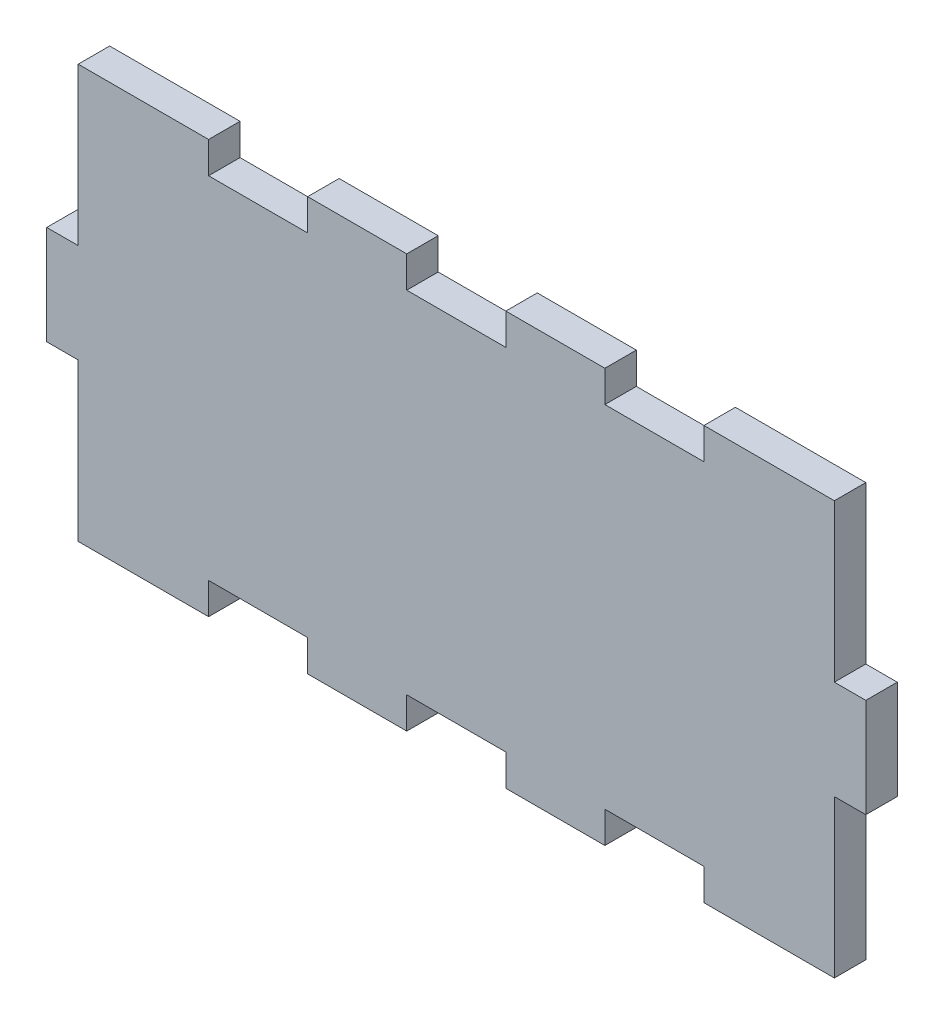
ISO-10303-21;
HEADER;
FILE_DESCRIPTION(('STEP AP214'),'2;1');
FILE_NAME('part.step','',(''),(''),'','','');
FILE_SCHEMA(('AUTOMOTIVE_DESIGN { 1 0 10303 214 1 1 1 1 }'));
ENDSEC;
DATA;
#1=APPLICATION_CONTEXT('core data for automotive mechanical design processes');
#2=APPLICATION_PROTOCOL_DEFINITION('international standard','automotive_design',2000,#1);
#3=PRODUCT_CONTEXT('',#1,'mechanical');
#4=PRODUCT('Part','Part','',(#3));
#5=PRODUCT_RELATED_PRODUCT_CATEGORY('part','',(#4));
#6=PRODUCT_DEFINITION_FORMATION('','',#4);
#7=PRODUCT_DEFINITION_CONTEXT('part definition',#1,'design');
#8=PRODUCT_DEFINITION('design','',#6,#7);
#9=PRODUCT_DEFINITION_SHAPE('','',#8);
#10=(LENGTH_UNIT() NAMED_UNIT(*) SI_UNIT(.MILLI.,.METRE.));
#11=(NAMED_UNIT(*) PLANE_ANGLE_UNIT() SI_UNIT($,.RADIAN.));
#12=(NAMED_UNIT(*) SI_UNIT($,.STERADIAN.) SOLID_ANGLE_UNIT());
#13=UNCERTAINTY_MEASURE_WITH_UNIT(LENGTH_MEASURE(1.E-05),#10,'distance_accuracy_value','');
#14=(GEOMETRIC_REPRESENTATION_CONTEXT(3) GLOBAL_UNCERTAINTY_ASSIGNED_CONTEXT((#13)) GLOBAL_UNIT_ASSIGNED_CONTEXT((#10,
#11,#12)) REPRESENTATION_CONTEXT('',''));
#15=CARTESIAN_POINT('',(0.,0.,0.));
#16=DIRECTION('',(0.,0.,1.));
#17=DIRECTION('',(1.,0.,0.));
#18=AXIS2_PLACEMENT_3D('',#15,#16,#17);
#19=CARTESIAN_POINT('',(-82.675,41.7195,6.35));
#20=DIRECTION('',(0.,-1.,0.));
#21=DIRECTION('',(0.,0.,-1.));
#22=AXIS2_PLACEMENT_3D('',#19,#20,#21);
#23=PLANE('',#22);
#24=DIRECTION('',(0.,0.,1.));
#25=VECTOR('',#24,1.);
#26=CARTESIAN_POINT('',(-30.,41.7195,0.));
#27=LINE('',#26,#25);
#28=CARTESIAN_POINT('',(-30.,41.7195,0.));
#29=VERTEX_POINT('',#28);
#30=CARTESIAN_POINT('',(-30.,41.7195,6.35));
#31=VERTEX_POINT('',#30);
#32=EDGE_CURVE('E333',#29,#31,#27,.T.);
#33=ORIENTED_EDGE('',*,*,#32,.T.);
#34=DIRECTION('',(-1.,0.,0.));
#35=VECTOR('',#34,1.);
#36=CARTESIAN_POINT('',(-82.675,41.7195,6.35));
#37=LINE('',#36,#35);
#38=CARTESIAN_POINT('',(-10.,41.7195,6.35));
#39=VERTEX_POINT('',#38);
#40=EDGE_CURVE('E714',#39,#31,#37,.T.);
#41=ORIENTED_EDGE('',*,*,#40,.F.);
#42=DIRECTION('',(0.,0.,1.));
#43=VECTOR('',#42,1.);
#44=CARTESIAN_POINT('',(-10.,41.7195,0.));
#45=LINE('',#44,#43);
#46=CARTESIAN_POINT('',(-10.,41.7195,0.));
#47=VERTEX_POINT('',#46);
#48=EDGE_CURVE('E378',#47,#39,#45,.T.);
#49=ORIENTED_EDGE('',*,*,#48,.F.);
#50=DIRECTION('',(-1.,0.,0.));
#51=VECTOR('',#50,1.);
#52=CARTESIAN_POINT('',(-82.675,41.7195,0.));
#53=LINE('',#52,#51);
#54=EDGE_CURVE('E730',#47,#29,#53,.T.);
#55=ORIENTED_EDGE('',*,*,#54,.T.);
#56=EDGE_LOOP('',(#33,#41,#49,#55));
#57=FACE_BOUND('',#56,.T.);
#58=ADVANCED_FACE('F39',(#57),#23,.F.);
#59=DIRECTION('',(0.,0.,1.));
#60=VECTOR('',#59,1.);
#61=CARTESIAN_POINT('',(-50.,41.7195,0.));
#62=LINE('',#61,#60);
#63=CARTESIAN_POINT('',(-50.,41.7195,0.));
#64=VERTEX_POINT('',#63);
#65=CARTESIAN_POINT('',(-50.,41.7195,6.35));
#66=VERTEX_POINT('',#65);
#67=EDGE_CURVE('E350',#64,#66,#62,.T.);
#68=ORIENTED_EDGE('',*,*,#67,.F.);
#69=CARTESIAN_POINT('',(-76.325,41.7195,0.));
#70=VERTEX_POINT('',#69);
#71=EDGE_CURVE('E570',#64,#70,#53,.T.);
#72=ORIENTED_EDGE('',*,*,#71,.T.);
#73=DIRECTION('',(0.,0.,1.));
#74=VECTOR('',#73,1.);
#75=CARTESIAN_POINT('',(-76.325,41.7195,0.));
#76=LINE('',#75,#74);
#77=CARTESIAN_POINT('',(-76.325,41.7195,6.35));
#78=VERTEX_POINT('',#77);
#79=EDGE_CURVE('E563',#70,#78,#76,.T.);
#80=ORIENTED_EDGE('',*,*,#79,.T.);
#81=EDGE_CURVE('E606',#66,#78,#37,.T.);
#82=ORIENTED_EDGE('',*,*,#81,.F.);
#83=EDGE_LOOP('',(#68,#72,#80,#82));
#84=FACE_BOUND('',#83,.T.);
#85=ADVANCED_FACE('F685',(#84),#23,.F.);
#86=DIRECTION('',(0.,0.,1.));
#87=VECTOR('',#86,1.);
#88=CARTESIAN_POINT('',(30.,41.7195,0.));
#89=LINE('',#88,#87);
#90=CARTESIAN_POINT('',(30.,41.7195,0.));
#91=VERTEX_POINT('',#90);
#92=CARTESIAN_POINT('',(30.,41.7195,6.35));
#93=VERTEX_POINT('',#92);
#94=EDGE_CURVE('E313',#91,#93,#89,.T.);
#95=ORIENTED_EDGE('',*,*,#94,.F.);
#96=CARTESIAN_POINT('',(10.,41.7195,0.));
#97=VERTEX_POINT('',#96);
#98=EDGE_CURVE('E297',#91,#97,#53,.T.);
#99=ORIENTED_EDGE('',*,*,#98,.T.);
#100=DIRECTION('',(0.,0.,1.));
#101=VECTOR('',#100,1.);
#102=CARTESIAN_POINT('',(10.,41.7195,0.));
#103=LINE('',#102,#101);
#104=CARTESIAN_POINT('',(10.,41.7195,6.35));
#105=VERTEX_POINT('',#104);
#106=EDGE_CURVE('E382',#97,#105,#103,.T.);
#107=ORIENTED_EDGE('',*,*,#106,.T.);
#108=EDGE_CURVE('E605',#93,#105,#37,.T.);
#109=ORIENTED_EDGE('',*,*,#108,.F.);
#110=EDGE_LOOP('',(#95,#99,#107,#109));
#111=FACE_BOUND('',#110,.T.);
#112=ADVANCED_FACE('F691',(#111),#23,.F.);
#113=DIRECTION('',(0.,0.,1.));
#114=VECTOR('',#113,1.);
#115=CARTESIAN_POINT('',(50.,41.7195,0.));
#116=LINE('',#115,#114);
#117=CARTESIAN_POINT('',(50.,41.7195,0.));
#118=VERTEX_POINT('',#117);
#119=CARTESIAN_POINT('',(50.,41.7195,6.35));
#120=VERTEX_POINT('',#119);
#121=EDGE_CURVE('E317',#118,#120,#116,.T.);
#122=ORIENTED_EDGE('',*,*,#121,.T.);
#123=CARTESIAN_POINT('',(76.325,41.7195,6.35));
#124=VERTEX_POINT('',#123);
#125=EDGE_CURVE('E600',#124,#120,#37,.T.);
#126=ORIENTED_EDGE('',*,*,#125,.F.);
#127=DIRECTION('',(0.,0.,1.));
#128=VECTOR('',#127,1.);
#129=CARTESIAN_POINT('',(76.325,41.7195,0.));
#130=LINE('',#129,#128);
#131=CARTESIAN_POINT('',(76.325,41.7195,0.));
#132=VERTEX_POINT('',#131);
#133=EDGE_CURVE('E534',#132,#124,#130,.T.);
#134=ORIENTED_EDGE('',*,*,#133,.F.);
#135=EDGE_CURVE('E615',#132,#118,#53,.T.);
#136=ORIENTED_EDGE('',*,*,#135,.T.);
#137=EDGE_LOOP('',(#122,#126,#134,#136));
#138=FACE_BOUND('',#137,.T.);
#139=ADVANCED_FACE('F687',(#138),#23,.F.);
#140=CARTESIAN_POINT('',(0.,0.,6.35));
#141=DIRECTION('',(0.,0.,-1.));
#142=DIRECTION('',(-1.,0.,0.));
#143=AXIS2_PLACEMENT_3D('',#140,#141,#142);
#144=PLANE('',#143);
#145=DIRECTION('',(0.,-1.,0.));
#146=VECTOR('',#145,1.);
#147=CARTESIAN_POINT('',(-30.,41.7195,6.35));
#148=LINE('',#147,#146);
#149=CARTESIAN_POINT('',(-30.,35.3695,6.35));
#150=VERTEX_POINT('',#149);
#151=EDGE_CURVE('E334',#31,#150,#148,.T.);
#152=ORIENTED_EDGE('',*,*,#151,.T.);
#153=DIRECTION('',(-1.,0.,0.));
#154=VECTOR('',#153,1.);
#155=CARTESIAN_POINT('',(-30.,35.3695,6.35));
#156=LINE('',#155,#154);
#157=CARTESIAN_POINT('',(-50.,35.3695,6.35));
#158=VERTEX_POINT('',#157);
#159=EDGE_CURVE('E327',#150,#158,#156,.T.);
#160=ORIENTED_EDGE('',*,*,#159,.T.);
#161=DIRECTION('',(0.,1.,0.));
#162=VECTOR('',#161,1.);
#163=CARTESIAN_POINT('',(-50.,41.7195,6.35));
#164=LINE('',#163,#162);
#165=EDGE_CURVE('E338',#158,#66,#164,.T.);
#166=ORIENTED_EDGE('',*,*,#165,.T.);
#167=ORIENTED_EDGE('',*,*,#81,.T.);
#168=DIRECTION('',(0.,1.,0.));
#169=VECTOR('',#168,1.);
#170=CARTESIAN_POINT('',(-76.325,10.,6.35));
#171=LINE('',#170,#169);
#172=CARTESIAN_POINT('',(-76.325,10.,6.35));
#173=VERTEX_POINT('',#172);
#174=EDGE_CURVE('E581',#173,#78,#171,.T.);
#175=ORIENTED_EDGE('',*,*,#174,.F.);
#176=DIRECTION('',(1.,0.,0.));
#177=VECTOR('',#176,1.);
#178=CARTESIAN_POINT('',(-82.675,10.,6.35));
#179=LINE('',#178,#177);
#180=CARTESIAN_POINT('',(-82.675,10.,6.35));
#181=VERTEX_POINT('',#180);
#182=EDGE_CURVE('E520',#181,#173,#179,.T.);
#183=ORIENTED_EDGE('',*,*,#182,.F.);
#184=DIRECTION('',(0.,-1.,0.));
#185=VECTOR('',#184,1.);
#186=CARTESIAN_POINT('',(-82.675,41.7195,6.35));
#187=LINE('',#186,#185);
#188=CARTESIAN_POINT('',(-82.675,-10.,6.35));
#189=VERTEX_POINT('',#188);
#190=EDGE_CURVE('E604',#181,#189,#187,.T.);
#191=ORIENTED_EDGE('',*,*,#190,.T.);
#192=DIRECTION('',(-1.,0.,0.));
#193=VECTOR('',#192,1.);
#194=CARTESIAN_POINT('',(-82.675,-10.,6.35));
#195=LINE('',#194,#193);
#196=CARTESIAN_POINT('',(-76.325,-10.,6.35));
#197=VERTEX_POINT('',#196);
#198=EDGE_CURVE('E554',#197,#189,#195,.T.);
#199=ORIENTED_EDGE('',*,*,#198,.F.);
#200=DIRECTION('',(0.,1.,0.));
#201=VECTOR('',#200,1.);
#202=CARTESIAN_POINT('',(-76.325,-41.7195,6.35));
#203=LINE('',#202,#201);
#204=CARTESIAN_POINT('',(-76.325,-41.7195,6.35));
#205=VERTEX_POINT('',#204);
#206=EDGE_CURVE('E559',#205,#197,#203,.T.);
#207=ORIENTED_EDGE('',*,*,#206,.F.);
#208=DIRECTION('',(1.,0.,0.));
#209=VECTOR('',#208,1.);
#210=CARTESIAN_POINT('',(-82.675,-41.7195,6.35));
#211=LINE('',#210,#209);
#212=CARTESIAN_POINT('',(-50.,-41.7195,6.35));
#213=VERTEX_POINT('',#212);
#214=EDGE_CURVE('E48',#205,#213,#211,.T.);
#215=ORIENTED_EDGE('',*,*,#214,.T.);
#216=DIRECTION('',(0.,-1.,0.));
#217=VECTOR('',#216,1.);
#218=CARTESIAN_POINT('',(-50.,-41.7195,6.35));
#219=LINE('',#218,#217);
#220=CARTESIAN_POINT('',(-50.,-35.3695,6.35));
#221=VERTEX_POINT('',#220);
#222=EDGE_CURVE('E434',#221,#213,#219,.T.);
#223=ORIENTED_EDGE('',*,*,#222,.F.);
#224=DIRECTION('',(-1.,0.,0.));
#225=VECTOR('',#224,1.);
#226=CARTESIAN_POINT('',(-30.,-35.3695,6.35));
#227=LINE('',#226,#225);
#228=CARTESIAN_POINT('',(-30.,-35.3695,6.35));
#229=VERTEX_POINT('',#228);
#230=EDGE_CURVE('E446',#229,#221,#227,.T.);
#231=ORIENTED_EDGE('',*,*,#230,.F.);
#232=DIRECTION('',(0.,1.,0.));
#233=VECTOR('',#232,1.);
#234=CARTESIAN_POINT('',(-30.,-41.7195,6.35));
#235=LINE('',#234,#233);
#236=CARTESIAN_POINT('',(-30.,-41.7195,6.35));
#237=VERTEX_POINT('',#236);
#238=EDGE_CURVE('E381',#237,#229,#235,.T.);
#239=ORIENTED_EDGE('',*,*,#238,.F.);
#240=CARTESIAN_POINT('',(-10.,-41.7195,6.35));
#241=VERTEX_POINT('',#240);
#242=EDGE_CURVE('E613',#237,#241,#211,.T.);
#243=ORIENTED_EDGE('',*,*,#242,.T.);
#244=DIRECTION('',(0.,-1.,0.));
#245=VECTOR('',#244,1.);
#246=CARTESIAN_POINT('',(-10.,-41.7195,6.35));
#247=LINE('',#246,#245);
#248=CARTESIAN_POINT('',(-10.,-35.3695,6.35));
#249=VERTEX_POINT('',#248);
#250=EDGE_CURVE('E419',#249,#241,#247,.T.);
#251=ORIENTED_EDGE('',*,*,#250,.F.);
#252=DIRECTION('',(-1.,0.,0.));
#253=VECTOR('',#252,1.);
#254=CARTESIAN_POINT('',(-10.,-35.3695,6.35));
#255=LINE('',#254,#253);
#256=CARTESIAN_POINT('',(10.,-35.3695,6.35));
#257=VERTEX_POINT('',#256);
#258=EDGE_CURVE('E468',#257,#249,#255,.T.);
#259=ORIENTED_EDGE('',*,*,#258,.F.);
#260=DIRECTION('',(0.,1.,0.));
#261=VECTOR('',#260,1.);
#262=CARTESIAN_POINT('',(10.,-41.7195,6.35));
#263=LINE('',#262,#261);
#264=CARTESIAN_POINT('',(10.,-41.7195,6.35));
#265=VERTEX_POINT('',#264);
#266=EDGE_CURVE('E479',#265,#257,#263,.T.);
#267=ORIENTED_EDGE('',*,*,#266,.F.);
#268=CARTESIAN_POINT('',(30.,-41.7195,6.35));
#269=VERTEX_POINT('',#268);
#270=EDGE_CURVE('E657',#265,#269,#211,.T.);
#271=ORIENTED_EDGE('',*,*,#270,.T.);
#272=DIRECTION('',(0.,-1.,0.));
#273=VECTOR('',#272,1.);
#274=CARTESIAN_POINT('',(30.,-41.7195,6.35));
#275=LINE('',#274,#273);
#276=CARTESIAN_POINT('',(30.,-35.3695,6.35));
#277=VERTEX_POINT('',#276);
#278=EDGE_CURVE('E405',#277,#269,#275,.T.);
#279=ORIENTED_EDGE('',*,*,#278,.F.);
#280=DIRECTION('',(-1.,0.,0.));
#281=VECTOR('',#280,1.);
#282=CARTESIAN_POINT('',(30.,-35.3695,6.35));
#283=LINE('',#282,#281);
#284=CARTESIAN_POINT('',(50.,-35.3695,6.35));
#285=VERTEX_POINT('',#284);
#286=EDGE_CURVE('E396',#285,#277,#283,.T.);
#287=ORIENTED_EDGE('',*,*,#286,.F.);
#288=DIRECTION('',(0.,1.,0.));
#289=VECTOR('',#288,1.);
#290=CARTESIAN_POINT('',(50.,-41.7195,6.35));
#291=LINE('',#290,#289);
#292=CARTESIAN_POINT('',(50.,-41.7195,6.35));
#293=VERTEX_POINT('',#292);
#294=EDGE_CURVE('E408',#293,#285,#291,.T.);
#295=ORIENTED_EDGE('',*,*,#294,.F.);
#296=CARTESIAN_POINT('',(76.325,-41.7195,6.35));
#297=VERTEX_POINT('',#296);
#298=EDGE_CURVE('E610',#293,#297,#211,.T.);
#299=ORIENTED_EDGE('',*,*,#298,.T.);
#300=DIRECTION('',(0.,1.,0.));
#301=VECTOR('',#300,1.);
#302=CARTESIAN_POINT('',(76.325,-41.7195,6.35));
#303=LINE('',#302,#301);
#304=CARTESIAN_POINT('',(76.325,-10.,6.35));
#305=VERTEX_POINT('',#304);
#306=EDGE_CURVE('E503',#297,#305,#303,.T.);
#307=ORIENTED_EDGE('',*,*,#306,.T.);
#308=DIRECTION('',(1.,0.,0.));
#309=VECTOR('',#308,1.);
#310=CARTESIAN_POINT('',(82.675,-10.,6.35));
#311=LINE('',#310,#309);
#312=CARTESIAN_POINT('',(82.675,-10.,6.35));
#313=VERTEX_POINT('',#312);
#314=EDGE_CURVE('E508',#305,#313,#311,.T.);
#315=ORIENTED_EDGE('',*,*,#314,.T.);
#316=DIRECTION('',(0.,1.,0.));
#317=VECTOR('',#316,1.);
#318=CARTESIAN_POINT('',(82.675,41.7195,6.35));
#319=LINE('',#318,#317);
#320=CARTESIAN_POINT('',(82.675,10.,6.35));
#321=VERTEX_POINT('',#320);
#322=EDGE_CURVE('E11',#313,#321,#319,.T.);
#323=ORIENTED_EDGE('',*,*,#322,.T.);
#324=DIRECTION('',(-1.,0.,0.));
#325=VECTOR('',#324,1.);
#326=CARTESIAN_POINT('',(82.675,10.,6.35));
#327=LINE('',#326,#325);
#328=CARTESIAN_POINT('',(76.325,10.,6.35));
#329=VERTEX_POINT('',#328);
#330=EDGE_CURVE('E530',#321,#329,#327,.T.);
#331=ORIENTED_EDGE('',*,*,#330,.T.);
#332=DIRECTION('',(0.,1.,0.));
#333=VECTOR('',#332,1.);
#334=CARTESIAN_POINT('',(76.325,10.,6.35));
#335=LINE('',#334,#333);
#336=EDGE_CURVE('E489',#329,#124,#335,.T.);
#337=ORIENTED_EDGE('',*,*,#336,.T.);
#338=ORIENTED_EDGE('',*,*,#125,.T.);
#339=DIRECTION('',(0.,-1.,0.));
#340=VECTOR('',#339,1.);
#341=CARTESIAN_POINT('',(50.,41.7195,6.35));
#342=LINE('',#341,#340);
#343=CARTESIAN_POINT('',(50.,35.3695,6.35));
#344=VERTEX_POINT('',#343);
#345=EDGE_CURVE('E299',#120,#344,#342,.T.);
#346=ORIENTED_EDGE('',*,*,#345,.T.);
#347=DIRECTION('',(-1.,0.,0.));
#348=VECTOR('',#347,1.);
#349=CARTESIAN_POINT('',(30.,35.3695,6.35));
#350=LINE('',#349,#348);
#351=CARTESIAN_POINT('',(30.,35.3695,6.35));
#352=VERTEX_POINT('',#351);
#353=EDGE_CURVE('E303',#344,#352,#350,.T.);
#354=ORIENTED_EDGE('',*,*,#353,.T.);
#355=DIRECTION('',(0.,1.,0.));
#356=VECTOR('',#355,1.);
#357=CARTESIAN_POINT('',(30.,41.7195,6.35));
#358=LINE('',#357,#356);
#359=EDGE_CURVE('E288',#352,#93,#358,.T.);
#360=ORIENTED_EDGE('',*,*,#359,.T.);
#361=ORIENTED_EDGE('',*,*,#108,.T.);
#362=DIRECTION('',(0.,-1.,0.));
#363=VECTOR('',#362,1.);
#364=CARTESIAN_POINT('',(10.,41.7195,6.35));
#365=LINE('',#364,#363);
#366=CARTESIAN_POINT('',(10.,35.3695,6.35));
#367=VERTEX_POINT('',#366);
#368=EDGE_CURVE('E360',#105,#367,#365,.T.);
#369=ORIENTED_EDGE('',*,*,#368,.T.);
#370=DIRECTION('',(-1.,0.,0.));
#371=VECTOR('',#370,1.);
#372=CARTESIAN_POINT('',(-10.,35.3695,6.35));
#373=LINE('',#372,#371);
#374=CARTESIAN_POINT('',(-10.,35.3695,6.35));
#375=VERTEX_POINT('',#374);
#376=EDGE_CURVE('E371',#367,#375,#373,.T.);
#377=ORIENTED_EDGE('',*,*,#376,.T.);
#378=DIRECTION('',(0.,1.,0.));
#379=VECTOR('',#378,1.);
#380=CARTESIAN_POINT('',(-10.,41.7195,6.35));
#381=LINE('',#380,#379);
#382=EDGE_CURVE('E316',#375,#39,#381,.T.);
#383=ORIENTED_EDGE('',*,*,#382,.T.);
#384=ORIENTED_EDGE('',*,*,#40,.T.);
#385=EDGE_LOOP('',(#152,#160,#166,#167,#175,#183,#191,#199,#207,#215,#223,#231,#239,#243,#251,
#259,#267,#271,#279,#287,#295,#299,#307,#315,#323,#331,#337,#338,#346,#354,#360,#361,#369,#377,
#383,#384));
#386=FACE_BOUND('',#385,.T.);
#387=ADVANCED_FACE('F654',(#386),#144,.F.);
#388=CARTESIAN_POINT('',(0.,0.,0.));
#389=DIRECTION('',(0.,0.,-1.));
#390=DIRECTION('',(-1.,0.,0.));
#391=AXIS2_PLACEMENT_3D('',#388,#389,#390);
#392=PLANE('',#391);
#393=DIRECTION('',(-1.,0.,0.));
#394=VECTOR('',#393,1.);
#395=CARTESIAN_POINT('',(-30.,35.3695,0.));
#396=LINE('',#395,#394);
#397=CARTESIAN_POINT('',(-30.,35.3695,0.));
#398=VERTEX_POINT('',#397);
#399=CARTESIAN_POINT('',(-50.,35.3695,0.));
#400=VERTEX_POINT('',#399);
#401=EDGE_CURVE('E330',#398,#400,#396,.T.);
#402=ORIENTED_EDGE('',*,*,#401,.F.);
#403=DIRECTION('',(0.,-1.,0.));
#404=VECTOR('',#403,1.);
#405=CARTESIAN_POINT('',(-30.,41.7195,0.));
#406=LINE('',#405,#404);
#407=EDGE_CURVE('E323',#29,#398,#406,.T.);
#408=ORIENTED_EDGE('',*,*,#407,.F.);
#409=ORIENTED_EDGE('',*,*,#54,.F.);
#410=DIRECTION('',(0.,1.,0.));
#411=VECTOR('',#410,1.);
#412=CARTESIAN_POINT('',(-10.,41.7195,0.));
#413=LINE('',#412,#411);
#414=CARTESIAN_POINT('',(-10.,35.3695,0.));
#415=VERTEX_POINT('',#414);
#416=EDGE_CURVE('E356',#415,#47,#413,.T.);
#417=ORIENTED_EDGE('',*,*,#416,.F.);
#418=DIRECTION('',(-1.,0.,0.));
#419=VECTOR('',#418,1.);
#420=CARTESIAN_POINT('',(-10.,35.3695,0.));
#421=LINE('',#420,#419);
#422=CARTESIAN_POINT('',(10.,35.3695,0.));
#423=VERTEX_POINT('',#422);
#424=EDGE_CURVE('E359',#423,#415,#421,.T.);
#425=ORIENTED_EDGE('',*,*,#424,.F.);
#426=DIRECTION('',(0.,-1.,0.));
#427=VECTOR('',#426,1.);
#428=CARTESIAN_POINT('',(10.,41.7195,0.));
#429=LINE('',#428,#427);
#430=EDGE_CURVE('E363',#97,#423,#429,.T.);
#431=ORIENTED_EDGE('',*,*,#430,.F.);
#432=ORIENTED_EDGE('',*,*,#98,.F.);
#433=DIRECTION('',(0.,1.,0.));
#434=VECTOR('',#433,1.);
#435=CARTESIAN_POINT('',(30.,41.7195,0.));
#436=LINE('',#435,#434);
#437=CARTESIAN_POINT('',(30.,35.3695,0.));
#438=VERTEX_POINT('',#437);
#439=EDGE_CURVE('E282',#438,#91,#436,.T.);
#440=ORIENTED_EDGE('',*,*,#439,.F.);
#441=DIRECTION('',(-1.,0.,0.));
#442=VECTOR('',#441,1.);
#443=CARTESIAN_POINT('',(30.,35.3695,0.));
#444=LINE('',#443,#442);
#445=CARTESIAN_POINT('',(50.,35.3695,0.));
#446=VERTEX_POINT('',#445);
#447=EDGE_CURVE('E272',#446,#438,#444,.T.);
#448=ORIENTED_EDGE('',*,*,#447,.F.);
#449=DIRECTION('',(0.,-1.,0.));
#450=VECTOR('',#449,1.);
#451=CARTESIAN_POINT('',(50.,41.7195,0.));
#452=LINE('',#451,#450);
#453=EDGE_CURVE('E281',#118,#446,#452,.T.);
#454=ORIENTED_EDGE('',*,*,#453,.F.);
#455=ORIENTED_EDGE('',*,*,#135,.F.);
#456=DIRECTION('',(0.,1.,0.));
#457=VECTOR('',#456,1.);
#458=CARTESIAN_POINT('',(76.325,10.,0.));
#459=LINE('',#458,#457);
#460=CARTESIAN_POINT('',(76.325,10.,0.));
#461=VERTEX_POINT('',#460);
#462=EDGE_CURVE('E526',#461,#132,#459,.T.);
#463=ORIENTED_EDGE('',*,*,#462,.F.);
#464=DIRECTION('',(-1.,0.,0.));
#465=VECTOR('',#464,1.);
#466=CARTESIAN_POINT('',(82.675,10.,0.));
#467=LINE('',#466,#465);
#468=CARTESIAN_POINT('',(82.675,10.,0.));
#469=VERTEX_POINT('',#468);
#470=EDGE_CURVE('E529',#469,#461,#467,.T.);
#471=ORIENTED_EDGE('',*,*,#470,.F.);
#472=DIRECTION('',(0.,1.,0.));
#473=VECTOR('',#472,1.);
#474=CARTESIAN_POINT('',(82.675,41.7195,0.));
#475=LINE('',#474,#473);
#476=CARTESIAN_POINT('',(82.675,-10.,0.));
#477=VERTEX_POINT('',#476);
#478=EDGE_CURVE('E42',#477,#469,#475,.T.);
#479=ORIENTED_EDGE('',*,*,#478,.F.);
#480=DIRECTION('',(1.,0.,0.));
#481=VECTOR('',#480,1.);
#482=CARTESIAN_POINT('',(82.675,-10.,0.));
#483=LINE('',#482,#481);
#484=CARTESIAN_POINT('',(76.325,-10.,0.));
#485=VERTEX_POINT('',#484);
#486=EDGE_CURVE('E499',#485,#477,#483,.T.);
#487=ORIENTED_EDGE('',*,*,#486,.F.);
#488=DIRECTION('',(0.,1.,0.));
#489=VECTOR('',#488,1.);
#490=CARTESIAN_POINT('',(76.325,-41.7195,0.));
#491=LINE('',#490,#489);
#492=CARTESIAN_POINT('',(76.325,-41.7195,0.));
#493=VERTEX_POINT('',#492);
#494=EDGE_CURVE('E502',#493,#485,#491,.T.);
#495=ORIENTED_EDGE('',*,*,#494,.F.);
#496=DIRECTION('',(1.,0.,0.));
#497=VECTOR('',#496,1.);
#498=CARTESIAN_POINT('',(-82.675,-41.7195,0.));
#499=LINE('',#498,#497);
#500=CARTESIAN_POINT('',(50.,-41.7195,0.));
#501=VERTEX_POINT('',#500);
#502=EDGE_CURVE('E622',#501,#493,#499,.T.);
#503=ORIENTED_EDGE('',*,*,#502,.F.);
#504=DIRECTION('',(0.,1.,0.));
#505=VECTOR('',#504,1.);
#506=CARTESIAN_POINT('',(50.,-41.7195,0.));
#507=LINE('',#506,#505);
#508=CARTESIAN_POINT('',(50.,-35.3695,0.));
#509=VERTEX_POINT('',#508);
#510=EDGE_CURVE('E395',#501,#509,#507,.T.);
#511=ORIENTED_EDGE('',*,*,#510,.T.);
#512=DIRECTION('',(-1.,0.,0.));
#513=VECTOR('',#512,1.);
#514=CARTESIAN_POINT('',(30.,-35.3695,0.));
#515=LINE('',#514,#513);
#516=CARTESIAN_POINT('',(30.,-35.3695,0.));
#517=VERTEX_POINT('',#516);
#518=EDGE_CURVE('E400',#509,#517,#515,.T.);
#519=ORIENTED_EDGE('',*,*,#518,.T.);
#520=DIRECTION('',(0.,-1.,0.));
#521=VECTOR('',#520,1.);
#522=CARTESIAN_POINT('',(30.,-41.7195,0.));
#523=LINE('',#522,#521);
#524=CARTESIAN_POINT('',(30.,-41.7195,0.));
#525=VERTEX_POINT('',#524);
#526=EDGE_CURVE('E391',#517,#525,#523,.T.);
#527=ORIENTED_EDGE('',*,*,#526,.T.);
#528=CARTESIAN_POINT('',(10.,-41.7195,0.));
#529=VERTEX_POINT('',#528);
#530=EDGE_CURVE('E634',#529,#525,#499,.T.);
#531=ORIENTED_EDGE('',*,*,#530,.F.);
#532=DIRECTION('',(0.,1.,0.));
#533=VECTOR('',#532,1.);
#534=CARTESIAN_POINT('',(10.,-41.7195,0.));
#535=LINE('',#534,#533);
#536=CARTESIAN_POINT('',(10.,-35.3695,0.));
#537=VERTEX_POINT('',#536);
#538=EDGE_CURVE('E467',#529,#537,#535,.T.);
#539=ORIENTED_EDGE('',*,*,#538,.T.);
#540=DIRECTION('',(-1.,0.,0.));
#541=VECTOR('',#540,1.);
#542=CARTESIAN_POINT('',(-10.,-35.3695,0.));
#543=LINE('',#542,#541);
#544=CARTESIAN_POINT('',(-10.,-35.3695,0.));
#545=VERTEX_POINT('',#544);
#546=EDGE_CURVE('E472',#537,#545,#543,.T.);
#547=ORIENTED_EDGE('',*,*,#546,.T.);
#548=DIRECTION('',(0.,-1.,0.));
#549=VECTOR('',#548,1.);
#550=CARTESIAN_POINT('',(-10.,-41.7195,0.));
#551=LINE('',#550,#549);
#552=CARTESIAN_POINT('',(-10.,-41.7195,0.));
#553=VERTEX_POINT('',#552);
#554=EDGE_CURVE('E463',#545,#553,#551,.T.);
#555=ORIENTED_EDGE('',*,*,#554,.T.);
#556=CARTESIAN_POINT('',(-30.,-41.7195,0.));
#557=VERTEX_POINT('',#556);
#558=EDGE_CURVE('E626',#557,#553,#499,.T.);
#559=ORIENTED_EDGE('',*,*,#558,.F.);
#560=DIRECTION('',(0.,1.,0.));
#561=VECTOR('',#560,1.);
#562=CARTESIAN_POINT('',(-30.,-41.7195,0.));
#563=LINE('',#562,#561);
#564=CARTESIAN_POINT('',(-30.,-35.3695,0.));
#565=VERTEX_POINT('',#564);
#566=EDGE_CURVE('E429',#557,#565,#563,.T.);
#567=ORIENTED_EDGE('',*,*,#566,.T.);
#568=DIRECTION('',(-1.,0.,0.));
#569=VECTOR('',#568,1.);
#570=CARTESIAN_POINT('',(-30.,-35.3695,0.));
#571=LINE('',#570,#569);
#572=CARTESIAN_POINT('',(-50.,-35.3695,0.));
#573=VERTEX_POINT('',#572);
#574=EDGE_CURVE('E433',#565,#573,#571,.T.);
#575=ORIENTED_EDGE('',*,*,#574,.T.);
#576=DIRECTION('',(0.,-1.,0.));
#577=VECTOR('',#576,1.);
#578=CARTESIAN_POINT('',(-50.,-41.7195,0.));
#579=LINE('',#578,#577);
#580=CARTESIAN_POINT('',(-50.,-41.7195,0.));
#581=VERTEX_POINT('',#580);
#582=EDGE_CURVE('E438',#573,#581,#579,.T.);
#583=ORIENTED_EDGE('',*,*,#582,.T.);
#584=CARTESIAN_POINT('',(-76.325,-41.7195,0.));
#585=VERTEX_POINT('',#584);
#586=EDGE_CURVE('E623',#585,#581,#499,.T.);
#587=ORIENTED_EDGE('',*,*,#586,.F.);
#588=DIRECTION('',(0.,1.,0.));
#589=VECTOR('',#588,1.);
#590=CARTESIAN_POINT('',(-76.325,-41.7195,0.));
#591=LINE('',#590,#589);
#592=CARTESIAN_POINT('',(-76.325,-10.,0.));
#593=VERTEX_POINT('',#592);
#594=EDGE_CURVE('E549',#585,#593,#591,.T.);
#595=ORIENTED_EDGE('',*,*,#594,.T.);
#596=DIRECTION('',(-1.,0.,0.));
#597=VECTOR('',#596,1.);
#598=CARTESIAN_POINT('',(-82.675,-10.,0.));
#599=LINE('',#598,#597);
#600=CARTESIAN_POINT('',(-82.675,-10.,0.));
#601=VERTEX_POINT('',#600);
#602=EDGE_CURVE('E553',#593,#601,#599,.T.);
#603=ORIENTED_EDGE('',*,*,#602,.T.);
#604=DIRECTION('',(0.,-1.,0.));
#605=VECTOR('',#604,1.);
#606=CARTESIAN_POINT('',(-82.675,41.7195,0.));
#607=LINE('',#606,#605);
#608=CARTESIAN_POINT('',(-82.675,10.,0.));
#609=VERTEX_POINT('',#608);
#610=EDGE_CURVE('E619',#609,#601,#607,.T.);
#611=ORIENTED_EDGE('',*,*,#610,.F.);
#612=DIRECTION('',(1.,0.,0.));
#613=VECTOR('',#612,1.);
#614=CARTESIAN_POINT('',(-82.675,10.,0.));
#615=LINE('',#614,#613);
#616=CARTESIAN_POINT('',(-76.325,10.,0.));
#617=VERTEX_POINT('',#616);
#618=EDGE_CURVE('E576',#609,#617,#615,.T.);
#619=ORIENTED_EDGE('',*,*,#618,.T.);
#620=DIRECTION('',(0.,1.,0.));
#621=VECTOR('',#620,1.);
#622=CARTESIAN_POINT('',(-76.325,10.,0.));
#623=LINE('',#622,#621);
#624=EDGE_CURVE('E580',#617,#70,#623,.T.);
#625=ORIENTED_EDGE('',*,*,#624,.T.);
#626=ORIENTED_EDGE('',*,*,#71,.F.);
#627=DIRECTION('',(0.,1.,0.));
#628=VECTOR('',#627,1.);
#629=CARTESIAN_POINT('',(-50.,41.7195,0.));
#630=LINE('',#629,#628);
#631=EDGE_CURVE('E326',#400,#64,#630,.T.);
#632=ORIENTED_EDGE('',*,*,#631,.F.);
#633=EDGE_LOOP('',(#402,#408,#409,#417,#425,#431,#432,#440,#448,#454,#455,#463,#471,#479,#487,
#495,#503,#511,#519,#527,#531,#539,#547,#555,#559,#567,#575,#583,#587,#595,#603,#611,#619,#625,
#626,#632));
#634=FACE_BOUND('',#633,.T.);
#635=ADVANCED_FACE('F294',(#634),#392,.T.);
#636=CARTESIAN_POINT('',(-82.675,-41.7195,6.35));
#637=DIRECTION('',(0.,1.,0.));
#638=DIRECTION('',(0.,0.,1.));
#639=AXIS2_PLACEMENT_3D('',#636,#637,#638);
#640=PLANE('',#639);
#641=ORIENTED_EDGE('',*,*,#242,.F.);
#642=DIRECTION('',(0.,0.,1.));
#643=VECTOR('',#642,1.);
#644=CARTESIAN_POINT('',(-30.,-41.7195,0.));
#645=LINE('',#644,#643);
#646=EDGE_CURVE('E409',#557,#237,#645,.T.);
#647=ORIENTED_EDGE('',*,*,#646,.F.);
#648=ORIENTED_EDGE('',*,*,#558,.T.);
#649=DIRECTION('',(0.,0.,1.));
#650=VECTOR('',#649,1.);
#651=CARTESIAN_POINT('',(-10.,-41.7195,0.));
#652=LINE('',#651,#650);
#653=EDGE_CURVE('E476',#553,#241,#652,.T.);
#654=ORIENTED_EDGE('',*,*,#653,.T.);
#655=EDGE_LOOP('',(#641,#647,#648,#654));
#656=FACE_BOUND('',#655,.T.);
#657=ADVANCED_FACE('F674',(#656),#640,.F.);
#658=ORIENTED_EDGE('',*,*,#530,.T.);
#659=DIRECTION('',(0.,0.,1.));
#660=VECTOR('',#659,1.);
#661=CARTESIAN_POINT('',(30.,-41.7195,0.));
#662=LINE('',#661,#660);
#663=EDGE_CURVE('E404',#525,#269,#662,.T.);
#664=ORIENTED_EDGE('',*,*,#663,.T.);
#665=ORIENTED_EDGE('',*,*,#270,.F.);
#666=DIRECTION('',(0.,0.,1.));
#667=VECTOR('',#666,1.);
#668=CARTESIAN_POINT('',(10.,-41.7195,0.));
#669=LINE('',#668,#667);
#670=EDGE_CURVE('E493',#529,#265,#669,.T.);
#671=ORIENTED_EDGE('',*,*,#670,.F.);
#672=EDGE_LOOP('',(#658,#664,#665,#671));
#673=FACE_BOUND('',#672,.T.);
#674=ADVANCED_FACE('F645',(#673),#640,.F.);
#675=ORIENTED_EDGE('',*,*,#586,.T.);
#676=DIRECTION('',(0.,0.,1.));
#677=VECTOR('',#676,1.);
#678=CARTESIAN_POINT('',(-50.,-41.7195,0.));
#679=LINE('',#678,#677);
#680=EDGE_CURVE('E454',#581,#213,#679,.T.);
#681=ORIENTED_EDGE('',*,*,#680,.T.);
#682=ORIENTED_EDGE('',*,*,#214,.F.);
#683=DIRECTION('',(0.,0.,1.));
#684=VECTOR('',#683,1.);
#685=CARTESIAN_POINT('',(-76.325,-41.7195,0.));
#686=LINE('',#685,#684);
#687=EDGE_CURVE('E558',#585,#205,#686,.T.);
#688=ORIENTED_EDGE('',*,*,#687,.F.);
#689=EDGE_LOOP('',(#675,#681,#682,#688));
#690=FACE_BOUND('',#689,.T.);
#691=ADVANCED_FACE('F672',(#690),#640,.F.);
#692=ORIENTED_EDGE('',*,*,#298,.F.);
#693=DIRECTION('',(0.,0.,1.));
#694=VECTOR('',#693,1.);
#695=CARTESIAN_POINT('',(50.,-41.7195,0.));
#696=LINE('',#695,#694);
#697=EDGE_CURVE('E423',#501,#293,#696,.T.);
#698=ORIENTED_EDGE('',*,*,#697,.F.);
#699=ORIENTED_EDGE('',*,*,#502,.T.);
#700=DIRECTION('',(0.,0.,1.));
#701=VECTOR('',#700,1.);
#702=CARTESIAN_POINT('',(76.325,-41.7195,0.));
#703=LINE('',#702,#701);
#704=EDGE_CURVE('E516',#493,#297,#703,.T.);
#705=ORIENTED_EDGE('',*,*,#704,.T.);
#706=EDGE_LOOP('',(#692,#698,#699,#705));
#707=FACE_BOUND('',#706,.T.);
#708=ADVANCED_FACE('F669',(#707),#640,.F.);
#709=CARTESIAN_POINT('',(82.675,41.7195,6.35));
#710=DIRECTION('',(-1.,0.,0.));
#711=DIRECTION('',(0.,0.,1.));
#712=AXIS2_PLACEMENT_3D('',#709,#710,#711);
#713=PLANE('',#712);
#714=DIRECTION('',(0.,0.,1.));
#715=VECTOR('',#714,1.);
#716=CARTESIAN_POINT('',(82.675,-10.,0.));
#717=LINE('',#716,#715);
#718=EDGE_CURVE('E507',#477,#313,#717,.T.);
#719=ORIENTED_EDGE('',*,*,#718,.F.);
#720=ORIENTED_EDGE('',*,*,#478,.T.);
#721=DIRECTION('',(0.,0.,1.));
#722=VECTOR('',#721,1.);
#723=CARTESIAN_POINT('',(82.675,10.,0.));
#724=LINE('',#723,#722);
#725=EDGE_CURVE('E512',#469,#321,#724,.T.);
#726=ORIENTED_EDGE('',*,*,#725,.T.);
#727=ORIENTED_EDGE('',*,*,#322,.F.);
#728=EDGE_LOOP('',(#719,#720,#726,#727));
#729=FACE_BOUND('',#728,.T.);
#730=ADVANCED_FACE('F671',(#729),#713,.F.);
#731=CARTESIAN_POINT('',(-82.675,41.7195,6.35));
#732=DIRECTION('',(1.,0.,0.));
#733=DIRECTION('',(0.,0.,-1.));
#734=AXIS2_PLACEMENT_3D('',#731,#732,#733);
#735=PLANE('',#734);
#736=ORIENTED_EDGE('',*,*,#610,.T.);
#737=DIRECTION('',(0.,0.,1.));
#738=VECTOR('',#737,1.);
#739=CARTESIAN_POINT('',(-82.675,-10.,0.));
#740=LINE('',#739,#738);
#741=EDGE_CURVE('E566',#601,#189,#740,.T.);
#742=ORIENTED_EDGE('',*,*,#741,.T.);
#743=ORIENTED_EDGE('',*,*,#190,.F.);
#744=DIRECTION('',(0.,0.,1.));
#745=VECTOR('',#744,1.);
#746=CARTESIAN_POINT('',(-82.675,10.,0.));
#747=LINE('',#746,#745);
#748=EDGE_CURVE('E585',#609,#181,#747,.T.);
#749=ORIENTED_EDGE('',*,*,#748,.F.);
#750=EDGE_LOOP('',(#736,#742,#743,#749));
#751=FACE_BOUND('',#750,.T.);
#752=ADVANCED_FACE('F679',(#751),#735,.F.);
#753=CARTESIAN_POINT('',(-76.325,10.,0.));
#754=DIRECTION('',(1.,0.,0.));
#755=DIRECTION('',(0.,1.,0.));
#756=AXIS2_PLACEMENT_3D('',#753,#754,#755);
#757=PLANE('',#756);
#758=ORIENTED_EDGE('',*,*,#174,.T.);
#759=ORIENTED_EDGE('',*,*,#79,.F.);
#760=ORIENTED_EDGE('',*,*,#624,.F.);
#761=DIRECTION('',(0.,0.,1.));
#762=VECTOR('',#761,1.);
#763=CARTESIAN_POINT('',(-76.325,10.,0.));
#764=LINE('',#763,#762);
#765=EDGE_CURVE('E595',#617,#173,#764,.T.);
#766=ORIENTED_EDGE('',*,*,#765,.T.);
#767=EDGE_LOOP('',(#758,#759,#760,#766));
#768=FACE_BOUND('',#767,.T.);
#769=ADVANCED_FACE('F725',(#768),#757,.F.);
#770=CARTESIAN_POINT('',(-82.675,10.,0.));
#771=DIRECTION('',(0.,-1.,0.));
#772=DIRECTION('',(0.,0.,-1.));
#773=AXIS2_PLACEMENT_3D('',#770,#771,#772);
#774=PLANE('',#773);
#775=ORIENTED_EDGE('',*,*,#182,.T.);
#776=ORIENTED_EDGE('',*,*,#765,.F.);
#777=ORIENTED_EDGE('',*,*,#618,.F.);
#778=ORIENTED_EDGE('',*,*,#748,.T.);
#779=EDGE_LOOP('',(#775,#776,#777,#778));
#780=FACE_BOUND('',#779,.T.);
#781=ADVANCED_FACE('F817',(#780),#774,.F.);
#782=CARTESIAN_POINT('',(-82.675,-10.,0.));
#783=DIRECTION('',(0.,1.,0.));
#784=DIRECTION('',(0.,0.,1.));
#785=AXIS2_PLACEMENT_3D('',#782,#783,#784);
#786=PLANE('',#785);
#787=ORIENTED_EDGE('',*,*,#198,.T.);
#788=ORIENTED_EDGE('',*,*,#741,.F.);
#789=ORIENTED_EDGE('',*,*,#602,.F.);
#790=DIRECTION('',(0.,0.,1.));
#791=VECTOR('',#790,1.);
#792=CARTESIAN_POINT('',(-76.325,-10.,0.));
#793=LINE('',#792,#791);
#794=EDGE_CURVE('E571',#593,#197,#793,.T.);
#795=ORIENTED_EDGE('',*,*,#794,.T.);
#796=EDGE_LOOP('',(#787,#788,#789,#795));
#797=FACE_BOUND('',#796,.T.);
#798=ADVANCED_FACE('F814',(#797),#786,.F.);
#799=CARTESIAN_POINT('',(-76.325,-41.7195,0.));
#800=DIRECTION('',(1.,0.,0.));
#801=DIRECTION('',(0.,0.,-1.));
#802=AXIS2_PLACEMENT_3D('',#799,#800,#801);
#803=PLANE('',#802);
#804=ORIENTED_EDGE('',*,*,#206,.T.);
#805=ORIENTED_EDGE('',*,*,#794,.F.);
#806=ORIENTED_EDGE('',*,*,#594,.F.);
#807=ORIENTED_EDGE('',*,*,#687,.T.);
#808=EDGE_LOOP('',(#804,#805,#806,#807));
#809=FACE_BOUND('',#808,.T.);
#810=ADVANCED_FACE('F810',(#809),#803,.F.);
#811=CARTESIAN_POINT('',(82.675,10.,0.));
#812=DIRECTION('',(0.,1.,0.));
#813=DIRECTION('',(0.,0.,1.));
#814=AXIS2_PLACEMENT_3D('',#811,#812,#813);
#815=PLANE('',#814);
#816=ORIENTED_EDGE('',*,*,#330,.F.);
#817=ORIENTED_EDGE('',*,*,#725,.F.);
#818=ORIENTED_EDGE('',*,*,#470,.T.);
#819=DIRECTION('',(0.,0.,1.));
#820=VECTOR('',#819,1.);
#821=CARTESIAN_POINT('',(76.325,10.,0.));
#822=LINE('',#821,#820);
#823=EDGE_CURVE('E544',#461,#329,#822,.T.);
#824=ORIENTED_EDGE('',*,*,#823,.T.);
#825=EDGE_LOOP('',(#816,#817,#818,#824));
#826=FACE_BOUND('',#825,.T.);
#827=ADVANCED_FACE('F807',(#826),#815,.T.);
#828=CARTESIAN_POINT('',(76.325,10.,0.));
#829=DIRECTION('',(1.,0.,0.));
#830=DIRECTION('',(0.,1.,0.));
#831=AXIS2_PLACEMENT_3D('',#828,#829,#830);
#832=PLANE('',#831);
#833=ORIENTED_EDGE('',*,*,#336,.F.);
#834=ORIENTED_EDGE('',*,*,#823,.F.);
#835=ORIENTED_EDGE('',*,*,#462,.T.);
#836=ORIENTED_EDGE('',*,*,#133,.T.);
#837=EDGE_LOOP('',(#833,#834,#835,#836));
#838=FACE_BOUND('',#837,.T.);
#839=ADVANCED_FACE('F707',(#838),#832,.T.);
#840=CARTESIAN_POINT('',(76.325,-41.7195,0.));
#841=DIRECTION('',(1.,0.,0.));
#842=DIRECTION('',(0.,0.,-1.));
#843=AXIS2_PLACEMENT_3D('',#840,#841,#842);
#844=PLANE('',#843);
#845=ORIENTED_EDGE('',*,*,#306,.F.);
#846=ORIENTED_EDGE('',*,*,#704,.F.);
#847=ORIENTED_EDGE('',*,*,#494,.T.);
#848=DIRECTION('',(0.,0.,1.));
#849=VECTOR('',#848,1.);
#850=CARTESIAN_POINT('',(76.325,-10.,0.));
#851=LINE('',#850,#849);
#852=EDGE_CURVE('E521',#485,#305,#851,.T.);
#853=ORIENTED_EDGE('',*,*,#852,.T.);
#854=EDGE_LOOP('',(#845,#846,#847,#853));
#855=FACE_BOUND('',#854,.T.);
#856=ADVANCED_FACE('F666',(#855),#844,.T.);
#857=CARTESIAN_POINT('',(82.675,-10.,0.));
#858=DIRECTION('',(0.,-1.,0.));
#859=DIRECTION('',(0.,0.,-1.));
#860=AXIS2_PLACEMENT_3D('',#857,#858,#859);
#861=PLANE('',#860);
#862=ORIENTED_EDGE('',*,*,#314,.F.);
#863=ORIENTED_EDGE('',*,*,#852,.F.);
#864=ORIENTED_EDGE('',*,*,#486,.T.);
#865=ORIENTED_EDGE('',*,*,#718,.T.);
#866=EDGE_LOOP('',(#862,#863,#864,#865));
#867=FACE_BOUND('',#866,.T.);
#868=ADVANCED_FACE('F800',(#867),#861,.T.);
#869=CARTESIAN_POINT('',(-10.,-41.7195,0.));
#870=DIRECTION('',(-1.,0.,0.));
#871=DIRECTION('',(0.,-1.,0.));
#872=AXIS2_PLACEMENT_3D('',#869,#870,#871);
#873=PLANE('',#872);
#874=ORIENTED_EDGE('',*,*,#250,.T.);
#875=ORIENTED_EDGE('',*,*,#653,.F.);
#876=ORIENTED_EDGE('',*,*,#554,.F.);
#877=DIRECTION('',(0.,0.,1.));
#878=VECTOR('',#877,1.);
#879=CARTESIAN_POINT('',(-10.,-35.3695,0.));
#880=LINE('',#879,#878);
#881=EDGE_CURVE('E486',#545,#249,#880,.T.);
#882=ORIENTED_EDGE('',*,*,#881,.T.);
#883=EDGE_LOOP('',(#874,#875,#876,#882));
#884=FACE_BOUND('',#883,.T.);
#885=ADVANCED_FACE('F793',(#884),#873,.F.);
#886=CARTESIAN_POINT('',(-10.,-35.3695,0.));
#887=DIRECTION('',(0.,1.,0.));
#888=DIRECTION('',(0.,0.,1.));
#889=AXIS2_PLACEMENT_3D('',#886,#887,#888);
#890=PLANE('',#889);
#891=ORIENTED_EDGE('',*,*,#258,.T.);
#892=ORIENTED_EDGE('',*,*,#881,.F.);
#893=ORIENTED_EDGE('',*,*,#546,.F.);
#894=DIRECTION('',(0.,0.,1.));
#895=VECTOR('',#894,1.);
#896=CARTESIAN_POINT('',(10.,-35.3695,0.));
#897=LINE('',#896,#895);
#898=EDGE_CURVE('E490',#537,#257,#897,.T.);
#899=ORIENTED_EDGE('',*,*,#898,.T.);
#900=EDGE_LOOP('',(#891,#892,#893,#899));
#901=FACE_BOUND('',#900,.T.);
#902=ADVANCED_FACE('F790',(#901),#890,.F.);
#903=CARTESIAN_POINT('',(10.,-41.7195,0.));
#904=DIRECTION('',(1.,0.,0.));
#905=DIRECTION('',(0.,1.,0.));
#906=AXIS2_PLACEMENT_3D('',#903,#904,#905);
#907=PLANE('',#906);
#908=ORIENTED_EDGE('',*,*,#266,.T.);
#909=ORIENTED_EDGE('',*,*,#898,.F.);
#910=ORIENTED_EDGE('',*,*,#538,.F.);
#911=ORIENTED_EDGE('',*,*,#670,.T.);
#912=EDGE_LOOP('',(#908,#909,#910,#911));
#913=FACE_BOUND('',#912,.T.);
#914=ADVANCED_FACE('F779',(#913),#907,.F.);
#915=CARTESIAN_POINT('',(30.,-41.7195,0.));
#916=DIRECTION('',(-1.,0.,0.));
#917=DIRECTION('',(0.,0.,1.));
#918=AXIS2_PLACEMENT_3D('',#915,#916,#917);
#919=PLANE('',#918);
#920=ORIENTED_EDGE('',*,*,#278,.T.);
#921=ORIENTED_EDGE('',*,*,#663,.F.);
#922=ORIENTED_EDGE('',*,*,#526,.F.);
#923=DIRECTION('',(0.,0.,1.));
#924=VECTOR('',#923,1.);
#925=CARTESIAN_POINT('',(30.,-35.3695,0.));
#926=LINE('',#925,#924);
#927=EDGE_CURVE('E416',#517,#277,#926,.T.);
#928=ORIENTED_EDGE('',*,*,#927,.T.);
#929=EDGE_LOOP('',(#920,#921,#922,#928));
#930=FACE_BOUND('',#929,.T.);
#931=ADVANCED_FACE('F650',(#930),#919,.F.);
#932=CARTESIAN_POINT('',(30.,-35.3695,0.));
#933=DIRECTION('',(0.,1.,0.));
#934=DIRECTION('',(0.,0.,1.));
#935=AXIS2_PLACEMENT_3D('',#932,#933,#934);
#936=PLANE('',#935);
#937=ORIENTED_EDGE('',*,*,#286,.T.);
#938=ORIENTED_EDGE('',*,*,#927,.F.);
#939=ORIENTED_EDGE('',*,*,#518,.F.);
#940=DIRECTION('',(0.,0.,1.));
#941=VECTOR('',#940,1.);
#942=CARTESIAN_POINT('',(50.,-35.3695,0.));
#943=LINE('',#942,#941);
#944=EDGE_CURVE('E420',#509,#285,#943,.T.);
#945=ORIENTED_EDGE('',*,*,#944,.T.);
#946=EDGE_LOOP('',(#937,#938,#939,#945));
#947=FACE_BOUND('',#946,.T.);
#948=ADVANCED_FACE('F768',(#947),#936,.F.);
#949=CARTESIAN_POINT('',(50.,-41.7195,0.));
#950=DIRECTION('',(1.,0.,0.));
#951=DIRECTION('',(0.,0.,-1.));
#952=AXIS2_PLACEMENT_3D('',#949,#950,#951);
#953=PLANE('',#952);
#954=ORIENTED_EDGE('',*,*,#294,.T.);
#955=ORIENTED_EDGE('',*,*,#944,.F.);
#956=ORIENTED_EDGE('',*,*,#510,.F.);
#957=ORIENTED_EDGE('',*,*,#697,.T.);
#958=EDGE_LOOP('',(#954,#955,#956,#957));
#959=FACE_BOUND('',#958,.T.);
#960=ADVANCED_FACE('F771',(#959),#953,.F.);
#961=CARTESIAN_POINT('',(-30.,-41.7195,0.));
#962=DIRECTION('',(1.,0.,0.));
#963=DIRECTION('',(0.,0.,-1.));
#964=AXIS2_PLACEMENT_3D('',#961,#962,#963);
#965=PLANE('',#964);
#966=ORIENTED_EDGE('',*,*,#238,.T.);
#967=DIRECTION('',(0.,0.,1.));
#968=VECTOR('',#967,1.);
#969=CARTESIAN_POINT('',(-30.,-35.3695,0.));
#970=LINE('',#969,#968);
#971=EDGE_CURVE('E442',#565,#229,#970,.T.);
#972=ORIENTED_EDGE('',*,*,#971,.F.);
#973=ORIENTED_EDGE('',*,*,#566,.F.);
#974=ORIENTED_EDGE('',*,*,#646,.T.);
#975=EDGE_LOOP('',(#966,#972,#973,#974));
#976=FACE_BOUND('',#975,.T.);
#977=ADVANCED_FACE('F775',(#976),#965,.F.);
#978=CARTESIAN_POINT('',(-50.,-41.7195,0.));
#979=DIRECTION('',(-1.,0.,0.));
#980=DIRECTION('',(0.,0.,1.));
#981=AXIS2_PLACEMENT_3D('',#978,#979,#980);
#982=PLANE('',#981);
#983=ORIENTED_EDGE('',*,*,#222,.T.);
#984=ORIENTED_EDGE('',*,*,#680,.F.);
#985=ORIENTED_EDGE('',*,*,#582,.F.);
#986=DIRECTION('',(0.,0.,1.));
#987=VECTOR('',#986,1.);
#988=CARTESIAN_POINT('',(-50.,-35.3695,0.));
#989=LINE('',#988,#987);
#990=EDGE_CURVE('E458',#573,#221,#989,.T.);
#991=ORIENTED_EDGE('',*,*,#990,.T.);
#992=EDGE_LOOP('',(#983,#984,#985,#991));
#993=FACE_BOUND('',#992,.T.);
#994=ADVANCED_FACE('F780',(#993),#982,.F.);
#995=CARTESIAN_POINT('',(-30.,-35.3695,0.));
#996=DIRECTION('',(0.,1.,0.));
#997=DIRECTION('',(-1.,0.,0.));
#998=AXIS2_PLACEMENT_3D('',#995,#996,#997);
#999=PLANE('',#998);
#1000=ORIENTED_EDGE('',*,*,#230,.T.);
#1001=ORIENTED_EDGE('',*,*,#990,.F.);
#1002=ORIENTED_EDGE('',*,*,#574,.F.);
#1003=ORIENTED_EDGE('',*,*,#971,.T.);
#1004=EDGE_LOOP('',(#1000,#1001,#1002,#1003));
#1005=FACE_BOUND('',#1004,.T.);
#1006=ADVANCED_FACE('F766',(#1005),#999,.F.);
#1007=CARTESIAN_POINT('',(-10.,41.7195,0.));
#1008=DIRECTION('',(1.,0.,0.));
#1009=DIRECTION('',(0.,1.,0.));
#1010=AXIS2_PLACEMENT_3D('',#1007,#1008,#1009);
#1011=PLANE('',#1010);
#1012=ORIENTED_EDGE('',*,*,#382,.F.);
#1013=DIRECTION('',(0.,0.,1.));
#1014=VECTOR('',#1013,1.);
#1015=CARTESIAN_POINT('',(-10.,35.3695,0.));
#1016=LINE('',#1015,#1014);
#1017=EDGE_CURVE('E367',#415,#375,#1016,.T.);
#1018=ORIENTED_EDGE('',*,*,#1017,.F.);
#1019=ORIENTED_EDGE('',*,*,#416,.T.);
#1020=ORIENTED_EDGE('',*,*,#48,.T.);
#1021=EDGE_LOOP('',(#1012,#1018,#1019,#1020));
#1022=FACE_BOUND('',#1021,.T.);
#1023=ADVANCED_FACE('F759',(#1022),#1011,.T.);
#1024=CARTESIAN_POINT('',(10.,41.7195,0.));
#1025=DIRECTION('',(-1.,0.,0.));
#1026=DIRECTION('',(0.,-1.,0.));
#1027=AXIS2_PLACEMENT_3D('',#1024,#1025,#1026);
#1028=PLANE('',#1027);
#1029=ORIENTED_EDGE('',*,*,#368,.F.);
#1030=ORIENTED_EDGE('',*,*,#106,.F.);
#1031=ORIENTED_EDGE('',*,*,#430,.T.);
#1032=DIRECTION('',(0.,0.,1.));
#1033=VECTOR('',#1032,1.);
#1034=CARTESIAN_POINT('',(10.,35.3695,0.));
#1035=LINE('',#1034,#1033);
#1036=EDGE_CURVE('E386',#423,#367,#1035,.T.);
#1037=ORIENTED_EDGE('',*,*,#1036,.T.);
#1038=EDGE_LOOP('',(#1029,#1030,#1031,#1037));
#1039=FACE_BOUND('',#1038,.T.);
#1040=ADVANCED_FACE('F755',(#1039),#1028,.T.);
#1041=CARTESIAN_POINT('',(-10.,35.3695,0.));
#1042=DIRECTION('',(0.,1.,0.));
#1043=DIRECTION('',(0.,0.,1.));
#1044=AXIS2_PLACEMENT_3D('',#1041,#1042,#1043);
#1045=PLANE('',#1044);
#1046=ORIENTED_EDGE('',*,*,#376,.F.);
#1047=ORIENTED_EDGE('',*,*,#1036,.F.);
#1048=ORIENTED_EDGE('',*,*,#424,.T.);
#1049=ORIENTED_EDGE('',*,*,#1017,.T.);
#1050=EDGE_LOOP('',(#1046,#1047,#1048,#1049));
#1051=FACE_BOUND('',#1050,.T.);
#1052=ADVANCED_FACE('F758',(#1051),#1045,.T.);
#1053=CARTESIAN_POINT('',(30.,41.7195,0.));
#1054=DIRECTION('',(1.,0.,0.));
#1055=DIRECTION('',(0.,0.,-1.));
#1056=AXIS2_PLACEMENT_3D('',#1053,#1054,#1055);
#1057=PLANE('',#1056);
#1058=ORIENTED_EDGE('',*,*,#359,.F.);
#1059=DIRECTION('',(0.,0.,1.));
#1060=VECTOR('',#1059,1.);
#1061=CARTESIAN_POINT('',(30.,35.3695,0.));
#1062=LINE('',#1061,#1060);
#1063=EDGE_CURVE('E275',#438,#352,#1062,.T.);
#1064=ORIENTED_EDGE('',*,*,#1063,.F.);
#1065=ORIENTED_EDGE('',*,*,#439,.T.);
#1066=ORIENTED_EDGE('',*,*,#94,.T.);
#1067=EDGE_LOOP('',(#1058,#1064,#1065,#1066));
#1068=FACE_BOUND('',#1067,.T.);
#1069=ADVANCED_FACE('F285',(#1068),#1057,.T.);
#1070=CARTESIAN_POINT('',(50.,41.7195,0.));
#1071=DIRECTION('',(-1.,0.,0.));
#1072=DIRECTION('',(0.,0.,1.));
#1073=AXIS2_PLACEMENT_3D('',#1070,#1071,#1072);
#1074=PLANE('',#1073);
#1075=ORIENTED_EDGE('',*,*,#345,.F.);
#1076=ORIENTED_EDGE('',*,*,#121,.F.);
#1077=ORIENTED_EDGE('',*,*,#453,.T.);
#1078=DIRECTION('',(0.,0.,1.));
#1079=VECTOR('',#1078,1.);
#1080=CARTESIAN_POINT('',(50.,35.3695,0.));
#1081=LINE('',#1080,#1079);
#1082=EDGE_CURVE('E64',#446,#344,#1081,.T.);
#1083=ORIENTED_EDGE('',*,*,#1082,.T.);
#1084=EDGE_LOOP('',(#1075,#1076,#1077,#1083));
#1085=FACE_BOUND('',#1084,.T.);
#1086=ADVANCED_FACE('F710',(#1085),#1074,.T.);
#1087=CARTESIAN_POINT('',(30.,35.3695,0.));
#1088=DIRECTION('',(0.,1.,0.));
#1089=DIRECTION('',(0.,0.,1.));
#1090=AXIS2_PLACEMENT_3D('',#1087,#1088,#1089);
#1091=PLANE('',#1090);
#1092=ORIENTED_EDGE('',*,*,#353,.F.);
#1093=ORIENTED_EDGE('',*,*,#1082,.F.);
#1094=ORIENTED_EDGE('',*,*,#447,.T.);
#1095=ORIENTED_EDGE('',*,*,#1063,.T.);
#1096=EDGE_LOOP('',(#1092,#1093,#1094,#1095));
#1097=FACE_BOUND('',#1096,.T.);
#1098=ADVANCED_FACE('F274',(#1097),#1091,.T.);
#1099=CARTESIAN_POINT('',(-30.,41.7195,0.));
#1100=DIRECTION('',(-1.,0.,0.));
#1101=DIRECTION('',(0.,0.,1.));
#1102=AXIS2_PLACEMENT_3D('',#1099,#1100,#1101);
#1103=PLANE('',#1102);
#1104=ORIENTED_EDGE('',*,*,#151,.F.);
#1105=ORIENTED_EDGE('',*,*,#32,.F.);
#1106=ORIENTED_EDGE('',*,*,#407,.T.);
#1107=DIRECTION('',(0.,0.,1.));
#1108=VECTOR('',#1107,1.);
#1109=CARTESIAN_POINT('',(-30.,35.3695,0.));
#1110=LINE('',#1109,#1108);
#1111=EDGE_CURVE('E310',#398,#150,#1110,.T.);
#1112=ORIENTED_EDGE('',*,*,#1111,.T.);
#1113=EDGE_LOOP('',(#1104,#1105,#1106,#1112));
#1114=FACE_BOUND('',#1113,.T.);
#1115=ADVANCED_FACE('F741',(#1114),#1103,.T.);
#1116=CARTESIAN_POINT('',(-30.,35.3695,0.));
#1117=DIRECTION('',(0.,1.,0.));
#1118=DIRECTION('',(-1.,0.,0.));
#1119=AXIS2_PLACEMENT_3D('',#1116,#1117,#1118);
#1120=PLANE('',#1119);
#1121=ORIENTED_EDGE('',*,*,#159,.F.);
#1122=ORIENTED_EDGE('',*,*,#1111,.F.);
#1123=ORIENTED_EDGE('',*,*,#401,.T.);
#1124=DIRECTION('',(0.,0.,1.));
#1125=VECTOR('',#1124,1.);
#1126=CARTESIAN_POINT('',(-50.,35.3695,0.));
#1127=LINE('',#1126,#1125);
#1128=EDGE_CURVE('E56',#400,#158,#1127,.T.);
#1129=ORIENTED_EDGE('',*,*,#1128,.T.);
#1130=EDGE_LOOP('',(#1121,#1122,#1123,#1129));
#1131=FACE_BOUND('',#1130,.T.);
#1132=ADVANCED_FACE('F743',(#1131),#1120,.T.);
#1133=CARTESIAN_POINT('',(-50.,41.7195,0.));
#1134=DIRECTION('',(1.,0.,0.));
#1135=DIRECTION('',(0.,0.,-1.));
#1136=AXIS2_PLACEMENT_3D('',#1133,#1134,#1135);
#1137=PLANE('',#1136);
#1138=ORIENTED_EDGE('',*,*,#165,.F.);
#1139=ORIENTED_EDGE('',*,*,#1128,.F.);
#1140=ORIENTED_EDGE('',*,*,#631,.T.);
#1141=ORIENTED_EDGE('',*,*,#67,.T.);
#1142=EDGE_LOOP('',(#1138,#1139,#1140,#1141));
#1143=FACE_BOUND('',#1142,.T.);
#1144=ADVANCED_FACE('F744',(#1143),#1137,.T.);
#1145=CLOSED_SHELL('',(#58,#85,#112,#139,#387,#635,#657,#674,#691,#708,#730,#752,#769,#781,#798,
#810,#827,#839,#856,#868,#885,#902,#914,#931,#948,#960,#977,#994,#1006,#1023,#1040,#1052,#1069,
#1086,#1098,#1115,#1132,#1144));
#1146=MANIFOLD_SOLID_BREP('B2',#1145);
#1147=ADVANCED_BREP_SHAPE_REPRESENTATION('',(#18,#1146),#14);
#1148=SHAPE_DEFINITION_REPRESENTATION(#9,#1147);
ENDSEC;
END-ISO-10303-21;
